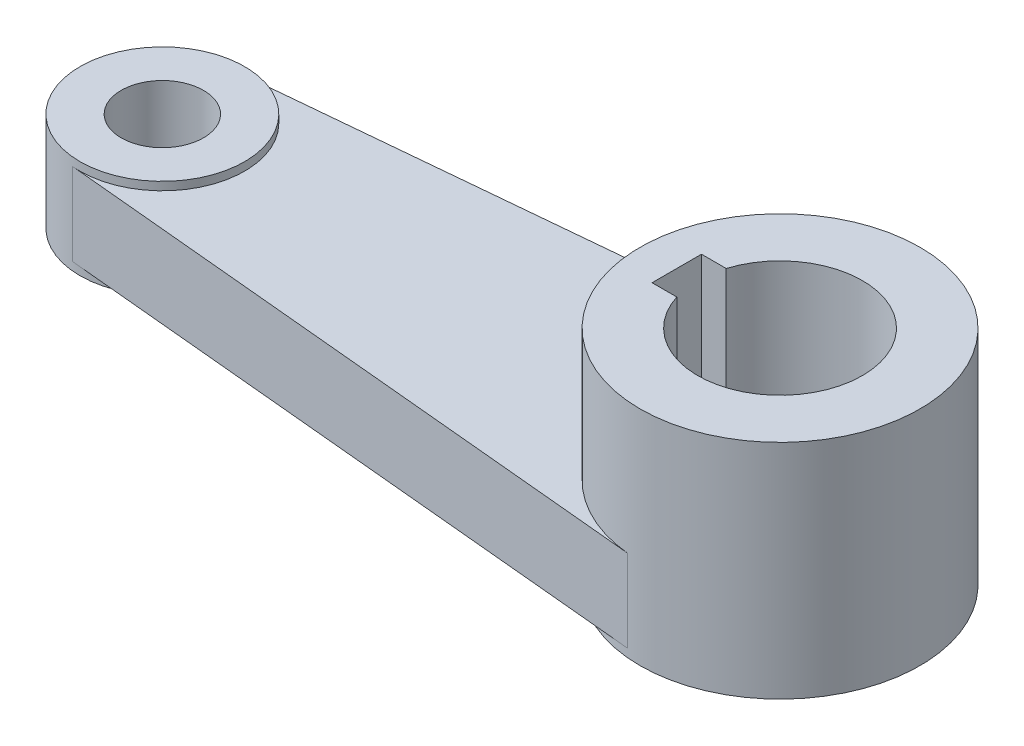
ISO-10303-21;
HEADER;
FILE_DESCRIPTION(('STEP AP214'),'2;1');
FILE_NAME('part.step','',(''),(''),'','','');
FILE_SCHEMA(('AUTOMOTIVE_DESIGN { 1 0 10303 214 1 1 1 1 }'));
ENDSEC;
DATA;
#1=APPLICATION_CONTEXT('core data for automotive mechanical design processes');
#2=APPLICATION_PROTOCOL_DEFINITION('international standard','automotive_design',2000,#1);
#3=PRODUCT_CONTEXT('',#1,'mechanical');
#4=PRODUCT('Part','Part','',(#3));
#5=PRODUCT_RELATED_PRODUCT_CATEGORY('part','',(#4));
#6=PRODUCT_DEFINITION_FORMATION('','',#4);
#7=PRODUCT_DEFINITION_CONTEXT('part definition',#1,'design');
#8=PRODUCT_DEFINITION('design','',#6,#7);
#9=PRODUCT_DEFINITION_SHAPE('','',#8);
#10=(LENGTH_UNIT() NAMED_UNIT(*) SI_UNIT(.MILLI.,.METRE.));
#11=(NAMED_UNIT(*) PLANE_ANGLE_UNIT() SI_UNIT($,.RADIAN.));
#12=(NAMED_UNIT(*) SI_UNIT($,.STERADIAN.) SOLID_ANGLE_UNIT());
#13=UNCERTAINTY_MEASURE_WITH_UNIT(LENGTH_MEASURE(1.E-05),#10,'distance_accuracy_value','');
#14=(GEOMETRIC_REPRESENTATION_CONTEXT(3) GLOBAL_UNCERTAINTY_ASSIGNED_CONTEXT((#13)) GLOBAL_UNIT_ASSIGNED_CONTEXT((#10,
#11,#12)) REPRESENTATION_CONTEXT('',''));
#15=CARTESIAN_POINT('',(0.,0.,0.));
#16=DIRECTION('',(0.,0.,1.));
#17=DIRECTION('',(1.,0.,0.));
#18=AXIS2_PLACEMENT_3D('',#15,#16,#17);
#19=CARTESIAN_POINT('',(-78.0893979015812,6.,0.));
#20=DIRECTION('',(0.,-1.,0.));
#21=DIRECTION('',(0.,0.,-1.));
#22=AXIS2_PLACEMENT_3D('',#19,#20,#21);
#23=CYLINDRICAL_SURFACE('',#22,4.99999999999999);
#24=CARTESIAN_POINT('',(-78.0893979015812,6.,0.));
#25=DIRECTION('',(0.,1.,0.));
#26=DIRECTION('',(0.,0.,1.));
#27=AXIS2_PLACEMENT_3D('',#24,#25,#26);
#28=CIRCLE('',#27,4.99999999999999);
#29=CARTESIAN_POINT('',(-78.0893979015812,6.,4.99999999999999));
#30=VERTEX_POINT('',#29);
#31=EDGE_CURVE('E52',#30,#30,#28,.T.);
#32=ORIENTED_EDGE('',*,*,#31,.T.);
#33=EDGE_LOOP('',(#32));
#34=FACE_BOUND('',#33,.T.);
#35=CARTESIAN_POINT('',(-78.0893979015812,-6.,0.));
#36=DIRECTION('',(0.,1.,0.));
#37=DIRECTION('',(0.,0.,1.));
#38=AXIS2_PLACEMENT_3D('',#35,#36,#37);
#39=CIRCLE('',#38,4.99999999999999);
#40=CARTESIAN_POINT('',(-78.0893979015812,-6.,4.99999999999999));
#41=VERTEX_POINT('',#40);
#42=EDGE_CURVE('E212',#41,#41,#39,.T.);
#43=ORIENTED_EDGE('',*,*,#42,.F.);
#44=EDGE_LOOP('',(#43));
#45=FACE_BOUND('',#44,.T.);
#46=ADVANCED_FACE('F43',(#34,#45),#23,.F.);
#47=CARTESIAN_POINT('',(-78.0893979015812,6.,0.));
#48=DIRECTION('',(0.,-1.,0.));
#49=DIRECTION('',(0.,0.,-1.));
#50=AXIS2_PLACEMENT_3D('',#47,#48,#49);
#51=CYLINDRICAL_SURFACE('',#50,9.99999999999999);
#52=DIRECTION('',(0.,-1.,0.));
#53=VECTOR('',#52,1.);
#54=CARTESIAN_POINT('',(-79.0227312349145,5.,9.95634917471705));
#55=LINE('',#54,#53);
#56=CARTESIAN_POINT('',(-79.0227312349145,5.,9.95634917471705));
#57=VERTEX_POINT('',#56);
#58=CARTESIAN_POINT('',(-79.0227312349145,-5.,9.95634917471705));
#59=VERTEX_POINT('',#58);
#60=EDGE_CURVE('E60',#57,#59,#55,.T.);
#61=ORIENTED_EDGE('',*,*,#60,.F.);
#62=CARTESIAN_POINT('',(-78.0893979015812,5.,0.));
#63=DIRECTION('',(0.,1.,0.));
#64=DIRECTION('',(0.,0.,1.));
#65=AXIS2_PLACEMENT_3D('',#62,#63,#64);
#66=CIRCLE('',#65,9.99999999999999);
#67=CARTESIAN_POINT('',(-79.0227312349145,5.,-9.95634917471705));
#68=VERTEX_POINT('',#67);
#69=EDGE_CURVE('E65',#57,#68,#66,.T.);
#70=ORIENTED_EDGE('',*,*,#69,.T.);
#71=DIRECTION('',(0.,-1.,0.));
#72=VECTOR('',#71,1.);
#73=CARTESIAN_POINT('',(-79.0227312349145,5.,-9.95634917471705));
#74=LINE('',#73,#72);
#75=CARTESIAN_POINT('',(-79.0227312349145,-5.,-9.95634917471705));
#76=VERTEX_POINT('',#75);
#77=EDGE_CURVE('E186',#68,#76,#74,.T.);
#78=ORIENTED_EDGE('',*,*,#77,.T.);
#79=CARTESIAN_POINT('',(-78.0893979015812,-5.,0.));
#80=DIRECTION('',(0.,1.,0.));
#81=DIRECTION('',(0.,0.,1.));
#82=AXIS2_PLACEMENT_3D('',#79,#80,#81);
#83=CIRCLE('',#82,9.99999999999999);
#84=EDGE_CURVE('E166',#59,#76,#83,.T.);
#85=ORIENTED_EDGE('',*,*,#84,.F.);
#86=EDGE_LOOP('',(#61,#70,#78,#85));
#87=FACE_BOUND('',#86,.T.);
#88=CARTESIAN_POINT('',(-78.0893979015812,6.,0.));
#89=DIRECTION('',(0.,1.,0.));
#90=DIRECTION('',(0.,0.,1.));
#91=AXIS2_PLACEMENT_3D('',#88,#89,#90);
#92=CIRCLE('',#91,9.99999999999999);
#93=CARTESIAN_POINT('',(-78.0893979015812,6.,9.99999999999999));
#94=VERTEX_POINT('',#93);
#95=EDGE_CURVE('E11',#94,#94,#92,.T.);
#96=ORIENTED_EDGE('',*,*,#95,.F.);
#97=EDGE_LOOP('',(#96));
#98=FACE_BOUND('',#97,.T.);
#99=CARTESIAN_POINT('',(-78.0893979015812,-6.,0.));
#100=DIRECTION('',(0.,1.,0.));
#101=DIRECTION('',(0.,0.,1.));
#102=AXIS2_PLACEMENT_3D('',#99,#100,#101);
#103=CIRCLE('',#102,9.99999999999999);
#104=CARTESIAN_POINT('',(-78.0893979015812,-6.,9.99999999999999));
#105=VERTEX_POINT('',#104);
#106=EDGE_CURVE('E46',#105,#105,#103,.T.);
#107=ORIENTED_EDGE('',*,*,#106,.T.);
#108=EDGE_LOOP('',(#107));
#109=FACE_BOUND('',#108,.T.);
#110=ADVANCED_FACE('F223',(#87,#98,#109),#51,.T.);
#111=CARTESIAN_POINT('',(0.,6.,0.));
#112=DIRECTION('',(0.,1.,0.));
#113=DIRECTION('',(0.,0.,1.));
#114=AXIS2_PLACEMENT_3D('',#111,#112,#113);
#115=PLANE('',#114);
#116=ORIENTED_EDGE('',*,*,#31,.F.);
#117=EDGE_LOOP('',(#116));
#118=FACE_BOUND('',#117,.T.);
#119=ORIENTED_EDGE('',*,*,#95,.T.);
#120=EDGE_LOOP('',(#119));
#121=FACE_BOUND('',#120,.T.);
#122=ADVANCED_FACE('F228',(#118,#121),#115,.T.);
#123=CARTESIAN_POINT('',(0.,-6.,0.));
#124=DIRECTION('',(0.,1.,0.));
#125=DIRECTION('',(0.,0.,1.));
#126=AXIS2_PLACEMENT_3D('',#123,#124,#125);
#127=PLANE('',#126);
#128=ORIENTED_EDGE('',*,*,#42,.T.);
#129=EDGE_LOOP('',(#128));
#130=FACE_BOUND('',#129,.T.);
#131=ORIENTED_EDGE('',*,*,#106,.F.);
#132=EDGE_LOOP('',(#131));
#133=FACE_BOUND('',#132,.T.);
#134=ADVANCED_FACE('F225',(#130,#133),#127,.F.);
#135=CARTESIAN_POINT('',(-1.61357875505377,5.,17.2128787566649));
#136=DIRECTION('',(0.0933333333333334,0.,-0.995634917471705));
#137=DIRECTION('',(-0.995634917471705,0.,-0.0933333333333333));
#138=AXIS2_PLACEMENT_3D('',#135,#136,#137);
#139=PLANE('',#138);
#140=DIRECTION('',(0.995634917471705,0.,0.0933333333333334));
#141=VECTOR('',#140,1.);
#142=CARTESIAN_POINT('',(-1.61357875505377,-5.,17.2128787566649));
#143=LINE('',#142,#141);
#144=CARTESIAN_POINT('',(-4.67606456824786,-5.,16.925793597019));
#145=VERTEX_POINT('',#144);
#146=EDGE_CURVE('E190',#59,#145,#143,.T.);
#147=ORIENTED_EDGE('',*,*,#146,.T.);
#148=DIRECTION('',(0.,-1.,0.));
#149=VECTOR('',#148,1.);
#150=CARTESIAN_POINT('',(-4.67606456824786,5.,16.925793597019));
#151=LINE('',#150,#149);
#152=CARTESIAN_POINT('',(-4.67606456824786,5.,16.925793597019));
#153=VERTEX_POINT('',#152);
#154=EDGE_CURVE('E207',#153,#145,#151,.T.);
#155=ORIENTED_EDGE('',*,*,#154,.F.);
#156=DIRECTION('',(0.995634917471705,0.,0.0933333333333334));
#157=VECTOR('',#156,1.);
#158=CARTESIAN_POINT('',(-1.61357875505377,5.,17.2128787566649));
#159=LINE('',#158,#157);
#160=EDGE_CURVE('E174',#57,#153,#159,.T.);
#161=ORIENTED_EDGE('',*,*,#160,.F.);
#162=ORIENTED_EDGE('',*,*,#60,.T.);
#163=EDGE_LOOP('',(#147,#155,#161,#162));
#164=FACE_BOUND('',#163,.T.);
#165=ADVANCED_FACE('F227',(#164),#139,.F.);
#166=CARTESIAN_POINT('',(-1.61357875505377,5.,-17.2128787566649));
#167=DIRECTION('',(-0.0933333333333334,0.,-0.995634917471705));
#168=DIRECTION('',(-0.995634917471705,0.,0.0933333333333333));
#169=AXIS2_PLACEMENT_3D('',#166,#167,#168);
#170=PLANE('',#169);
#171=DIRECTION('',(0.995634917471705,0.,-0.0933333333333334));
#172=VECTOR('',#171,1.);
#173=CARTESIAN_POINT('',(-1.61357875505377,-5.,-17.2128787566649));
#174=LINE('',#173,#172);
#175=CARTESIAN_POINT('',(-4.67606456824786,-5.,-16.925793597019));
#176=VERTEX_POINT('',#175);
#177=EDGE_CURVE('E175',#76,#176,#174,.T.);
#178=ORIENTED_EDGE('',*,*,#177,.F.);
#179=ORIENTED_EDGE('',*,*,#77,.F.);
#180=DIRECTION('',(0.995634917471705,0.,-0.0933333333333334));
#181=VECTOR('',#180,1.);
#182=CARTESIAN_POINT('',(-1.61357875505377,5.,-17.2128787566649));
#183=LINE('',#182,#181);
#184=CARTESIAN_POINT('',(-4.67606456824786,5.,-16.925793597019));
#185=VERTEX_POINT('',#184);
#186=EDGE_CURVE('E182',#68,#185,#183,.T.);
#187=ORIENTED_EDGE('',*,*,#186,.T.);
#188=DIRECTION('',(0.,-1.,0.));
#189=VECTOR('',#188,1.);
#190=CARTESIAN_POINT('',(-4.67606456824786,5.,-16.925793597019));
#191=LINE('',#190,#189);
#192=EDGE_CURVE('E203',#185,#176,#191,.T.);
#193=ORIENTED_EDGE('',*,*,#192,.T.);
#194=EDGE_LOOP('',(#178,#179,#187,#193));
#195=FACE_BOUND('',#194,.T.);
#196=ADVANCED_FACE('F234',(#195),#170,.T.);
#197=CARTESIAN_POINT('',(0.,5.,0.));
#198=DIRECTION('',(0.,1.,0.));
#199=DIRECTION('',(0.,0.,1.));
#200=AXIS2_PLACEMENT_3D('',#197,#198,#199);
#201=PLANE('',#200);
#202=ORIENTED_EDGE('',*,*,#69,.F.);
#203=ORIENTED_EDGE('',*,*,#160,.T.);
#204=CARTESIAN_POINT('',(-3.08939790158119,5.,0.));
#205=DIRECTION('',(0.,1.,0.));
#206=DIRECTION('',(0.,0.,1.));
#207=AXIS2_PLACEMENT_3D('',#204,#205,#206);
#208=CIRCLE('',#207,17.);
#209=EDGE_CURVE('E179',#185,#153,#208,.T.);
#210=ORIENTED_EDGE('',*,*,#209,.F.);
#211=ORIENTED_EDGE('',*,*,#186,.F.);
#212=EDGE_LOOP('',(#202,#203,#210,#211));
#213=FACE_BOUND('',#212,.T.);
#214=ADVANCED_FACE('F284',(#213),#201,.T.);
#215=CARTESIAN_POINT('',(0.,-5.,0.));
#216=DIRECTION('',(0.,1.,0.));
#217=DIRECTION('',(0.,0.,1.));
#218=AXIS2_PLACEMENT_3D('',#215,#216,#217);
#219=PLANE('',#218);
#220=ORIENTED_EDGE('',*,*,#84,.T.);
#221=ORIENTED_EDGE('',*,*,#177,.T.);
#222=CARTESIAN_POINT('',(-3.08939790158119,-5.,0.));
#223=DIRECTION('',(0.,1.,0.));
#224=DIRECTION('',(0.,0.,1.));
#225=AXIS2_PLACEMENT_3D('',#222,#223,#224);
#226=CIRCLE('',#225,17.);
#227=EDGE_CURVE('E194',#176,#145,#226,.T.);
#228=ORIENTED_EDGE('',*,*,#227,.T.);
#229=ORIENTED_EDGE('',*,*,#146,.F.);
#230=EDGE_LOOP('',(#220,#221,#228,#229));
#231=FACE_BOUND('',#230,.T.);
#232=ADVANCED_FACE('F295',(#231),#219,.F.);
#233=CARTESIAN_POINT('',(0.,-6.,2.99999999999999));
#234=DIRECTION('',(0.,0.,-1.));
#235=DIRECTION('',(-1.,0.,0.));
#236=AXIS2_PLACEMENT_3D('',#233,#234,#235);
#237=PLANE('',#236);
#238=DIRECTION('',(0.,1.,0.));
#239=VECTOR('',#238,1.);
#240=CARTESIAN_POINT('',(-15.6287899157506,-6.,3.));
#241=LINE('',#240,#239);
#242=CARTESIAN_POINT('',(-15.6287899157506,-6.,3.));
#243=VERTEX_POINT('',#242);
#244=CARTESIAN_POINT('',(-15.6287899157506,21.,3.));
#245=VERTEX_POINT('',#244);
#246=EDGE_CURVE('E109',#243,#245,#241,.T.);
#247=ORIENTED_EDGE('',*,*,#246,.T.);
#248=DIRECTION('',(-1.,0.,0.));
#249=VECTOR('',#248,1.);
#250=CARTESIAN_POINT('',(0.,21.,2.99999999999999));
#251=LINE('',#250,#249);
#252=CARTESIAN_POINT('',(-12.6287899157506,21.,3.));
#253=VERTEX_POINT('',#252);
#254=EDGE_CURVE('E113',#253,#245,#251,.T.);
#255=ORIENTED_EDGE('',*,*,#254,.F.);
#256=DIRECTION('',(0.,1.,0.));
#257=VECTOR('',#256,1.);
#258=CARTESIAN_POINT('',(-12.6287899157506,-6.,3.));
#259=LINE('',#258,#257);
#260=CARTESIAN_POINT('',(-12.6287899157506,-6.,3.));
#261=VERTEX_POINT('',#260);
#262=EDGE_CURVE('E163',#261,#253,#259,.T.);
#263=ORIENTED_EDGE('',*,*,#262,.F.);
#264=DIRECTION('',(-1.,0.,0.));
#265=VECTOR('',#264,1.);
#266=CARTESIAN_POINT('',(0.,-6.,2.99999999999999));
#267=LINE('',#266,#265);
#268=EDGE_CURVE('E116',#261,#243,#267,.T.);
#269=ORIENTED_EDGE('',*,*,#268,.T.);
#270=EDGE_LOOP('',(#247,#255,#263,#269));
#271=FACE_BOUND('',#270,.T.);
#272=ADVANCED_FACE('F111',(#271),#237,.T.);
#273=CARTESIAN_POINT('',(-3.08939790158119,-6.,0.));
#274=DIRECTION('',(0.,1.,0.));
#275=DIRECTION('',(0.,0.,1.));
#276=AXIS2_PLACEMENT_3D('',#273,#274,#275);
#277=CYLINDRICAL_SURFACE('',#276,10.);
#278=ORIENTED_EDGE('',*,*,#262,.T.);
#279=CARTESIAN_POINT('',(-3.08939790158119,21.,0.));
#280=DIRECTION('',(0.,1.,0.));
#281=DIRECTION('',(0.,0.,1.));
#282=AXIS2_PLACEMENT_3D('',#279,#280,#281);
#283=CIRCLE('',#282,10.);
#284=CARTESIAN_POINT('',(-12.6287899157506,21.,-3.));
#285=VERTEX_POINT('',#284);
#286=EDGE_CURVE('E137',#253,#285,#283,.T.);
#287=ORIENTED_EDGE('',*,*,#286,.T.);
#288=DIRECTION('',(0.,1.,0.));
#289=VECTOR('',#288,1.);
#290=CARTESIAN_POINT('',(-12.6287899157506,-6.,-3.));
#291=LINE('',#290,#289);
#292=CARTESIAN_POINT('',(-12.6287899157506,-6.,-3.));
#293=VERTEX_POINT('',#292);
#294=EDGE_CURVE('E167',#293,#285,#291,.T.);
#295=ORIENTED_EDGE('',*,*,#294,.F.);
#296=CARTESIAN_POINT('',(-3.08939790158119,-6.,0.));
#297=DIRECTION('',(0.,1.,0.));
#298=DIRECTION('',(0.,0.,1.));
#299=AXIS2_PLACEMENT_3D('',#296,#297,#298);
#300=CIRCLE('',#299,10.);
#301=EDGE_CURVE('E157',#261,#293,#300,.T.);
#302=ORIENTED_EDGE('',*,*,#301,.F.);
#303=EDGE_LOOP('',(#278,#287,#295,#302));
#304=FACE_BOUND('',#303,.T.);
#305=ADVANCED_FACE('F322',(#304),#277,.F.);
#306=CARTESIAN_POINT('',(0.,-6.,-2.99999999999999));
#307=DIRECTION('',(0.,0.,-1.));
#308=DIRECTION('',(-1.,0.,0.));
#309=AXIS2_PLACEMENT_3D('',#306,#307,#308);
#310=PLANE('',#309);
#311=ORIENTED_EDGE('',*,*,#294,.T.);
#312=DIRECTION('',(-1.,0.,0.));
#313=VECTOR('',#312,1.);
#314=CARTESIAN_POINT('',(0.,21.,-2.99999999999999));
#315=LINE('',#314,#313);
#316=CARTESIAN_POINT('',(-15.6287899157506,21.,-3.));
#317=VERTEX_POINT('',#316);
#318=EDGE_CURVE('E132',#285,#317,#315,.T.);
#319=ORIENTED_EDGE('',*,*,#318,.T.);
#320=DIRECTION('',(0.,1.,0.));
#321=VECTOR('',#320,1.);
#322=CARTESIAN_POINT('',(-15.6287899157506,-6.,-3.));
#323=LINE('',#322,#321);
#324=CARTESIAN_POINT('',(-15.6287899157506,-6.,-3.));
#325=VERTEX_POINT('',#324);
#326=EDGE_CURVE('E121',#325,#317,#323,.T.);
#327=ORIENTED_EDGE('',*,*,#326,.F.);
#328=DIRECTION('',(-1.,0.,0.));
#329=VECTOR('',#328,1.);
#330=CARTESIAN_POINT('',(0.,-6.,-2.99999999999999));
#331=LINE('',#330,#329);
#332=EDGE_CURVE('E154',#293,#325,#331,.T.);
#333=ORIENTED_EDGE('',*,*,#332,.F.);
#334=EDGE_LOOP('',(#311,#319,#327,#333));
#335=FACE_BOUND('',#334,.T.);
#336=ADVANCED_FACE('F332',(#335),#310,.F.);
#337=CARTESIAN_POINT('',(-15.6287899157506,-6.,0.));
#338=DIRECTION('',(1.,0.,0.));
#339=DIRECTION('',(0.,0.,-1.));
#340=AXIS2_PLACEMENT_3D('',#337,#338,#339);
#341=PLANE('',#340);
#342=ORIENTED_EDGE('',*,*,#326,.T.);
#343=DIRECTION('',(0.,0.,-1.));
#344=VECTOR('',#343,1.);
#345=CARTESIAN_POINT('',(-15.6287899157506,21.,0.));
#346=LINE('',#345,#344);
#347=EDGE_CURVE('E125',#245,#317,#346,.T.);
#348=ORIENTED_EDGE('',*,*,#347,.F.);
#349=ORIENTED_EDGE('',*,*,#246,.F.);
#350=DIRECTION('',(0.,0.,-1.));
#351=VECTOR('',#350,1.);
#352=CARTESIAN_POINT('',(-15.6287899157506,-6.,0.));
#353=LINE('',#352,#351);
#354=EDGE_CURVE('E151',#243,#325,#353,.T.);
#355=ORIENTED_EDGE('',*,*,#354,.T.);
#356=EDGE_LOOP('',(#342,#348,#349,#355));
#357=FACE_BOUND('',#356,.T.);
#358=ADVANCED_FACE('F126',(#357),#341,.T.);
#359=CARTESIAN_POINT('',(-3.08939790158119,-6.,0.));
#360=DIRECTION('',(0.,1.,0.));
#361=DIRECTION('',(0.,0.,1.));
#362=AXIS2_PLACEMENT_3D('',#359,#360,#361);
#363=CYLINDRICAL_SURFACE('',#362,17.);
#364=ORIENTED_EDGE('',*,*,#192,.F.);
#365=ORIENTED_EDGE('',*,*,#209,.T.);
#366=ORIENTED_EDGE('',*,*,#154,.T.);
#367=ORIENTED_EDGE('',*,*,#227,.F.);
#368=EDGE_LOOP('',(#364,#365,#366,#367));
#369=FACE_BOUND('',#368,.T.);
#370=CARTESIAN_POINT('',(-3.08939790158119,-6.,0.));
#371=DIRECTION('',(0.,1.,0.));
#372=DIRECTION('',(0.,0.,1.));
#373=AXIS2_PLACEMENT_3D('',#370,#371,#372);
#374=CIRCLE('',#373,17.);
#375=CARTESIAN_POINT('',(-3.08939790158119,-6.,17.));
#376=VERTEX_POINT('',#375);
#377=EDGE_CURVE('E122',#376,#376,#374,.T.);
#378=ORIENTED_EDGE('',*,*,#377,.T.);
#379=EDGE_LOOP('',(#378));
#380=FACE_BOUND('',#379,.T.);
#381=CARTESIAN_POINT('',(-3.08939790158119,21.,0.));
#382=DIRECTION('',(0.,1.,0.));
#383=DIRECTION('',(0.,0.,1.));
#384=AXIS2_PLACEMENT_3D('',#381,#382,#383);
#385=CIRCLE('',#384,17.);
#386=CARTESIAN_POINT('',(-3.08939790158119,21.,17.));
#387=VERTEX_POINT('',#386);
#388=EDGE_CURVE('E145',#387,#387,#385,.T.);
#389=ORIENTED_EDGE('',*,*,#388,.F.);
#390=EDGE_LOOP('',(#389));
#391=FACE_BOUND('',#390,.T.);
#392=ADVANCED_FACE('F353',(#369,#380,#391),#363,.T.);
#393=CARTESIAN_POINT('',(0.,-6.,0.));
#394=DIRECTION('',(0.,1.,0.));
#395=DIRECTION('',(0.,0.,1.));
#396=AXIS2_PLACEMENT_3D('',#393,#394,#395);
#397=PLANE('',#396);
#398=ORIENTED_EDGE('',*,*,#268,.F.);
#399=ORIENTED_EDGE('',*,*,#301,.T.);
#400=ORIENTED_EDGE('',*,*,#332,.T.);
#401=ORIENTED_EDGE('',*,*,#354,.F.);
#402=EDGE_LOOP('',(#398,#399,#400,#401));
#403=FACE_BOUND('',#402,.T.);
#404=ORIENTED_EDGE('',*,*,#377,.F.);
#405=EDGE_LOOP('',(#404));
#406=FACE_BOUND('',#405,.T.);
#407=ADVANCED_FACE('F363',(#403,#406),#397,.F.);
#408=CARTESIAN_POINT('',(0.,21.,0.));
#409=DIRECTION('',(0.,1.,0.));
#410=DIRECTION('',(0.,0.,1.));
#411=AXIS2_PLACEMENT_3D('',#408,#409,#410);
#412=PLANE('',#411);
#413=ORIENTED_EDGE('',*,*,#254,.T.);
#414=ORIENTED_EDGE('',*,*,#347,.T.);
#415=ORIENTED_EDGE('',*,*,#318,.F.);
#416=ORIENTED_EDGE('',*,*,#286,.F.);
#417=EDGE_LOOP('',(#413,#414,#415,#416));
#418=FACE_BOUND('',#417,.T.);
#419=ORIENTED_EDGE('',*,*,#388,.T.);
#420=EDGE_LOOP('',(#419));
#421=FACE_BOUND('',#420,.T.);
#422=ADVANCED_FACE('F134',(#418,#421),#412,.T.);
#423=CLOSED_SHELL('',(#46,#110,#122,#134,#165,#196,#214,#232,#272,#305,#336,#358,#392,#407,#422));
#424=MANIFOLD_SOLID_BREP('B2',#423);
#425=ADVANCED_BREP_SHAPE_REPRESENTATION('',(#18,#424),#14);
#426=SHAPE_DEFINITION_REPRESENTATION(#9,#425);
ENDSEC;
END-ISO-10303-21;
